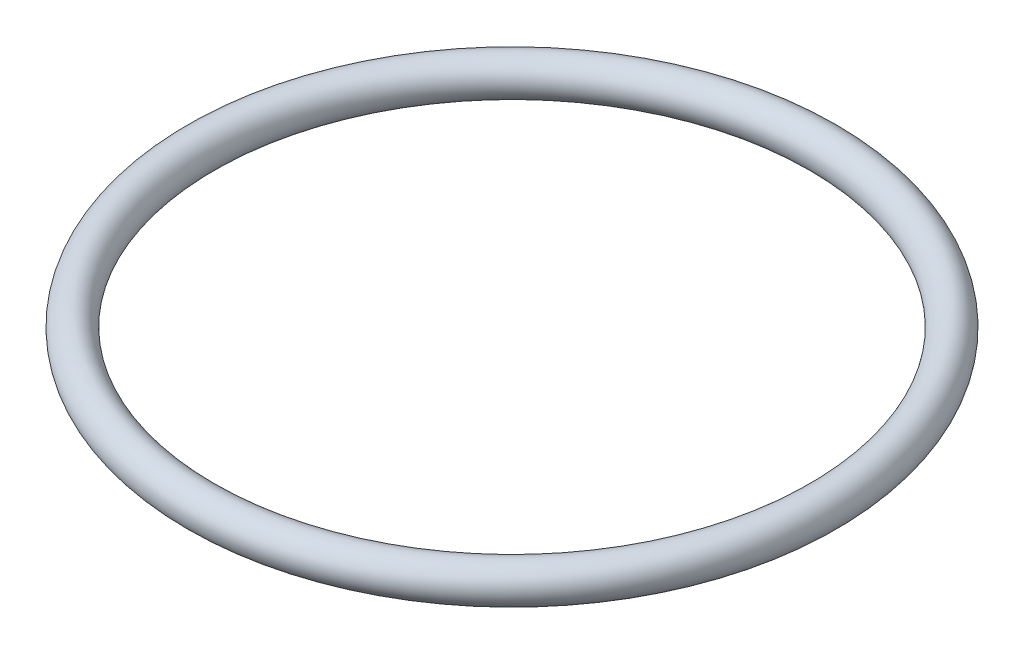
ISO-10303-21;
HEADER;
FILE_DESCRIPTION(('STEP AP214'),'2;1');
FILE_NAME('part.step','',(''),(''),'','','');
FILE_SCHEMA(('AUTOMOTIVE_DESIGN { 1 0 10303 214 1 1 1 1 }'));
ENDSEC;
DATA;
#1=APPLICATION_CONTEXT('core data for automotive mechanical design processes');
#2=APPLICATION_PROTOCOL_DEFINITION('international standard','automotive_design',2000,#1);
#3=PRODUCT_CONTEXT('',#1,'mechanical');
#4=PRODUCT('Part','Part','',(#3));
#5=PRODUCT_RELATED_PRODUCT_CATEGORY('part','',(#4));
#6=PRODUCT_DEFINITION_FORMATION('','',#4);
#7=PRODUCT_DEFINITION_CONTEXT('part definition',#1,'design');
#8=PRODUCT_DEFINITION('design','',#6,#7);
#9=PRODUCT_DEFINITION_SHAPE('','',#8);
#10=(LENGTH_UNIT() NAMED_UNIT(*) SI_UNIT(.MILLI.,.METRE.));
#11=(NAMED_UNIT(*) PLANE_ANGLE_UNIT() SI_UNIT($,.RADIAN.));
#12=(NAMED_UNIT(*) SI_UNIT($,.STERADIAN.) SOLID_ANGLE_UNIT());
#13=UNCERTAINTY_MEASURE_WITH_UNIT(LENGTH_MEASURE(1.E-05),#10,'distance_accuracy_value','');
#14=(GEOMETRIC_REPRESENTATION_CONTEXT(3) GLOBAL_UNCERTAINTY_ASSIGNED_CONTEXT((#13)) GLOBAL_UNIT_ASSIGNED_CONTEXT((#10,
#11,#12)) REPRESENTATION_CONTEXT('',''));
#15=CARTESIAN_POINT('',(0.,0.,0.));
#16=DIRECTION('',(0.,0.,1.));
#17=DIRECTION('',(1.,0.,0.));
#18=AXIS2_PLACEMENT_3D('',#15,#16,#17);
#19=CARTESIAN_POINT('',(0.,-1.38996771953505,0.));
#20=DIRECTION('',(0.,1.,0.));
#21=DIRECTION('',(0.,0.,1.));
#22=AXIS2_PLACEMENT_3D('',#19,#20,#21);
#23=TOROIDAL_SURFACE('',#22,25.,1.5);
#24=CARTESIAN_POINT('',(0.,-1.38996771953505,26.5));
#25=VERTEX_POINT('',#24);
#26=VERTEX_LOOP('',#25);
#27=FACE_BOUND('',#26,.T.);
#28=ADVANCED_FACE('F35',(#27),#23,.T.);
#29=CLOSED_SHELL('',(#28));
#30=MANIFOLD_SOLID_BREP('B2',#29);
#31=ADVANCED_BREP_SHAPE_REPRESENTATION('',(#18,#30),#14);
#32=SHAPE_DEFINITION_REPRESENTATION(#9,#31);
ENDSEC;
END-ISO-10303-21;
